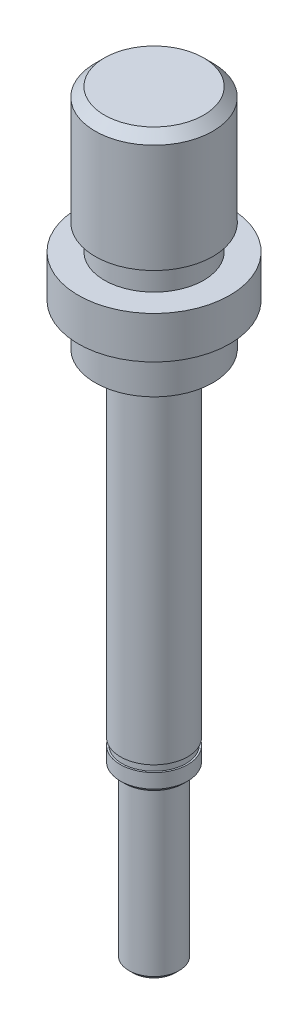
ISO-10303-21;
HEADER;
FILE_DESCRIPTION(('STEP AP214'),'2;1');
FILE_NAME('part.step','',(''),(''),'','','');
FILE_SCHEMA(('AUTOMOTIVE_DESIGN { 1 0 10303 214 1 1 1 1 }'));
ENDSEC;
DATA;
#1=APPLICATION_CONTEXT('core data for automotive mechanical design processes');
#2=APPLICATION_PROTOCOL_DEFINITION('international standard','automotive_design',2000,#1);
#3=PRODUCT_CONTEXT('',#1,'mechanical');
#4=PRODUCT('Part','Part','',(#3));
#5=PRODUCT_RELATED_PRODUCT_CATEGORY('part','',(#4));
#6=PRODUCT_DEFINITION_FORMATION('','',#4);
#7=PRODUCT_DEFINITION_CONTEXT('part definition',#1,'design');
#8=PRODUCT_DEFINITION('design','',#6,#7);
#9=PRODUCT_DEFINITION_SHAPE('','',#8);
#10=(LENGTH_UNIT() NAMED_UNIT(*) SI_UNIT(.MILLI.,.METRE.));
#11=(NAMED_UNIT(*) PLANE_ANGLE_UNIT() SI_UNIT($,.RADIAN.));
#12=(NAMED_UNIT(*) SI_UNIT($,.STERADIAN.) SOLID_ANGLE_UNIT());
#13=UNCERTAINTY_MEASURE_WITH_UNIT(LENGTH_MEASURE(1.E-05),#10,'distance_accuracy_value','');
#14=(GEOMETRIC_REPRESENTATION_CONTEXT(3) GLOBAL_UNCERTAINTY_ASSIGNED_CONTEXT((#13)) GLOBAL_UNIT_ASSIGNED_CONTEXT((#10,
#11,#12)) REPRESENTATION_CONTEXT('',''));
#15=CARTESIAN_POINT('',(0.,0.,0.));
#16=DIRECTION('',(0.,0.,1.));
#17=DIRECTION('',(1.,0.,0.));
#18=AXIS2_PLACEMENT_3D('',#15,#16,#17);
#19=CARTESIAN_POINT('',(-9.2098046360951E-13,73.,0.));
#20=DIRECTION('',(0.,1.,0.));
#21=DIRECTION('',(-1.,0.,0.));
#22=AXIS2_PLACEMENT_3D('',#19,#20,#21);
#23=PLANE('',#22);
#24=CARTESIAN_POINT('',(0.,73.,0.));
#25=DIRECTION('',(0.,-1.,0.));
#26=DIRECTION('',(1.,0.,0.));
#27=AXIS2_PLACEMENT_3D('',#24,#25,#26);
#28=CIRCLE('',#27,5.9);
#29=CARTESIAN_POINT('',(5.9,73.,0.));
#30=VERTEX_POINT('',#29);
#31=EDGE_CURVE('E78',#30,#30,#28,.T.);
#32=ORIENTED_EDGE('',*,*,#31,.T.);
#33=EDGE_LOOP('',(#32));
#34=FACE_BOUND('',#33,.T.);
#35=CARTESIAN_POINT('',(0.,73.,0.));
#36=DIRECTION('',(0.,-1.,0.));
#37=DIRECTION('',(1.,0.,0.));
#38=AXIS2_PLACEMENT_3D('',#35,#36,#37);
#39=CIRCLE('',#38,8.99999999999999);
#40=CARTESIAN_POINT('',(8.99999999999999,73.,0.));
#41=VERTEX_POINT('',#40);
#42=EDGE_CURVE('E126',#41,#41,#39,.T.);
#43=ORIENTED_EDGE('',*,*,#42,.F.);
#44=EDGE_LOOP('',(#43));
#45=FACE_BOUND('',#44,.T.);
#46=ADVANCED_FACE('F50',(#34,#45),#23,.T.);
#47=CARTESIAN_POINT('',(0.,0.,0.));
#48=DIRECTION('',(0.,-1.,0.));
#49=DIRECTION('',(1.,0.,0.));
#50=AXIS2_PLACEMENT_3D('',#47,#48,#49);
#51=CYLINDRICAL_SURFACE('',#50,5.9);
#52=CARTESIAN_POINT('',(0.,76.,0.));
#53=DIRECTION('',(0.,-1.,0.));
#54=DIRECTION('',(1.,0.,0.));
#55=AXIS2_PLACEMENT_3D('',#52,#53,#54);
#56=CIRCLE('',#55,5.9);
#57=CARTESIAN_POINT('',(5.9,76.,0.));
#58=VERTEX_POINT('',#57);
#59=EDGE_CURVE('E82',#58,#58,#56,.T.);
#60=ORIENTED_EDGE('',*,*,#59,.T.);
#61=EDGE_LOOP('',(#60));
#62=FACE_BOUND('',#61,.T.);
#63=ORIENTED_EDGE('',*,*,#31,.F.);
#64=EDGE_LOOP('',(#63));
#65=FACE_BOUND('',#64,.T.);
#66=ADVANCED_FACE('F158',(#62,#65),#51,.T.);
#67=CARTESIAN_POINT('',(-9.5882897581264E-13,76.,0.));
#68=DIRECTION('',(0.,1.,0.));
#69=DIRECTION('',(-1.,0.,0.));
#70=AXIS2_PLACEMENT_3D('',#67,#68,#69);
#71=PLANE('',#70);
#72=ORIENTED_EDGE('',*,*,#59,.F.);
#73=EDGE_LOOP('',(#72));
#74=FACE_BOUND('',#73,.T.);
#75=CARTESIAN_POINT('',(0.,76.,0.));
#76=DIRECTION('',(0.,-1.,0.));
#77=DIRECTION('',(1.,0.,0.));
#78=AXIS2_PLACEMENT_3D('',#75,#76,#77);
#79=CIRCLE('',#78,7.);
#80=CARTESIAN_POINT('',(7.,76.,0.));
#81=VERTEX_POINT('',#80);
#82=EDGE_CURVE('E86',#81,#81,#79,.T.);
#83=ORIENTED_EDGE('',*,*,#82,.T.);
#84=EDGE_LOOP('',(#83));
#85=FACE_BOUND('',#84,.T.);
#86=ADVANCED_FACE('F164',(#74,#85),#71,.F.);
#87=CARTESIAN_POINT('',(0.,0.,0.));
#88=DIRECTION('',(0.,-1.,0.));
#89=DIRECTION('',(1.,0.,0.));
#90=AXIS2_PLACEMENT_3D('',#87,#88,#89);
#91=CYLINDRICAL_SURFACE('',#90,7.);
#92=CARTESIAN_POINT('',(0.,88.8985,0.));
#93=DIRECTION('',(0.,-1.,0.));
#94=DIRECTION('',(0.,0.,-1.));
#95=AXIS2_PLACEMENT_3D('',#92,#93,#94);
#96=CIRCLE('',#95,7.);
#97=CARTESIAN_POINT('',(0.,88.8985,-7.));
#98=VERTEX_POINT('',#97);
#99=EDGE_CURVE('E129',#98,#98,#96,.T.);
#100=ORIENTED_EDGE('',*,*,#99,.T.);
#101=EDGE_LOOP('',(#100));
#102=FACE_BOUND('',#101,.T.);
#103=ORIENTED_EDGE('',*,*,#82,.F.);
#104=EDGE_LOOP('',(#103));
#105=FACE_BOUND('',#104,.T.);
#106=ADVANCED_FACE('F174',(#102,#105),#91,.T.);
#107=CARTESIAN_POINT('',(0.,0.,0.));
#108=DIRECTION('',(0.,1.,0.));
#109=DIRECTION('',(-1.,0.,0.));
#110=AXIS2_PLACEMENT_3D('',#107,#108,#109);
#111=PLANE('',#110);
#112=CARTESIAN_POINT('',(0.,0.,0.));
#113=DIRECTION('',(0.,1.,0.));
#114=DIRECTION('',(-1.,0.,0.));
#115=AXIS2_PLACEMENT_3D('',#112,#113,#114);
#116=CIRCLE('',#115,2.498);
#117=CARTESIAN_POINT('',(-2.498,0.,0.));
#118=VERTEX_POINT('',#117);
#119=EDGE_CURVE('E59',#118,#118,#116,.F.);
#120=ORIENTED_EDGE('',*,*,#119,.T.);
#121=EDGE_LOOP('',(#120));
#122=FACE_BOUND('',#121,.T.);
#123=ADVANCED_FACE('F180',(#122),#111,.F.);
#124=CARTESIAN_POINT('',(0.,0.,0.));
#125=DIRECTION('',(0.,-1.,0.));
#126=DIRECTION('',(1.,0.,0.));
#127=AXIS2_PLACEMENT_3D('',#124,#125,#126);
#128=CYLINDRICAL_SURFACE('',#127,2.998);
#129=CARTESIAN_POINT('',(0.,0.499999999999996,0.));
#130=DIRECTION('',(0.,1.,0.));
#131=DIRECTION('',(-1.,0.,0.));
#132=AXIS2_PLACEMENT_3D('',#129,#130,#131);
#133=CIRCLE('',#132,2.998);
#134=CARTESIAN_POINT('',(-2.998,0.499999999999996,0.));
#135=VERTEX_POINT('',#134);
#136=EDGE_CURVE('E10',#135,#135,#133,.T.);
#137=ORIENTED_EDGE('',*,*,#136,.T.);
#138=EDGE_LOOP('',(#137));
#139=FACE_BOUND('',#138,.T.);
#140=CARTESIAN_POINT('',(0.,20.,0.));
#141=DIRECTION('',(0.,-1.,0.));
#142=DIRECTION('',(1.,0.,0.));
#143=AXIS2_PLACEMENT_3D('',#140,#141,#142);
#144=CIRCLE('',#143,2.998);
#145=CARTESIAN_POINT('',(2.998,20.,0.));
#146=VERTEX_POINT('',#145);
#147=EDGE_CURVE('E90',#146,#146,#144,.T.);
#148=ORIENTED_EDGE('',*,*,#147,.T.);
#149=EDGE_LOOP('',(#148));
#150=FACE_BOUND('',#149,.T.);
#151=ADVANCED_FACE('F192',(#139,#150),#128,.T.);
#152=CARTESIAN_POINT('',(0.,20.,0.));
#153=DIRECTION('',(0.,1.,0.));
#154=DIRECTION('',(-1.,0.,0.));
#155=AXIS2_PLACEMENT_3D('',#152,#153,#154);
#156=PLANE('',#155);
#157=CARTESIAN_POINT('',(0.,20.,0.));
#158=DIRECTION('',(0.,1.,0.));
#159=DIRECTION('',(-1.,0.,0.));
#160=AXIS2_PLACEMENT_3D('',#157,#158,#159);
#161=CIRCLE('',#160,3.498);
#162=CARTESIAN_POINT('',(-3.498,20.,0.));
#163=VERTEX_POINT('',#162);
#164=EDGE_CURVE('E72',#163,#163,#161,.F.);
#165=ORIENTED_EDGE('',*,*,#164,.T.);
#166=EDGE_LOOP('',(#165));
#167=FACE_BOUND('',#166,.T.);
#168=ORIENTED_EDGE('',*,*,#147,.F.);
#169=EDGE_LOOP('',(#168));
#170=FACE_BOUND('',#169,.T.);
#171=ADVANCED_FACE('F231',(#167,#170),#156,.F.);
#172=CARTESIAN_POINT('',(0.,0.,0.));
#173=DIRECTION('',(0.,-1.,0.));
#174=DIRECTION('',(1.,0.,0.));
#175=AXIS2_PLACEMENT_3D('',#172,#173,#174);
#176=CYLINDRICAL_SURFACE('',#175,3.998);
#177=CARTESIAN_POINT('',(0.,20.5,0.));
#178=DIRECTION('',(0.,1.,0.));
#179=DIRECTION('',(-1.,0.,0.));
#180=AXIS2_PLACEMENT_3D('',#177,#178,#179);
#181=CIRCLE('',#180,3.998);
#182=CARTESIAN_POINT('',(-3.998,20.5,0.));
#183=VERTEX_POINT('',#182);
#184=EDGE_CURVE('E66',#183,#183,#181,.T.);
#185=ORIENTED_EDGE('',*,*,#184,.T.);
#186=EDGE_LOOP('',(#185));
#187=FACE_BOUND('',#186,.T.);
#188=CARTESIAN_POINT('',(0.,22.2,0.));
#189=DIRECTION('',(0.,-1.,0.));
#190=DIRECTION('',(1.,0.,0.));
#191=AXIS2_PLACEMENT_3D('',#188,#189,#190);
#192=CIRCLE('',#191,3.998);
#193=CARTESIAN_POINT('',(3.998,22.2,0.));
#194=VERTEX_POINT('',#193);
#195=EDGE_CURVE('E94',#194,#194,#192,.T.);
#196=ORIENTED_EDGE('',*,*,#195,.T.);
#197=EDGE_LOOP('',(#196));
#198=FACE_BOUND('',#197,.T.);
#199=ADVANCED_FACE('F218',(#187,#198),#176,.T.);
#200=CARTESIAN_POINT('',(0.,22.2,0.));
#201=DIRECTION('',(0.,1.,0.));
#202=DIRECTION('',(-1.,0.,0.));
#203=AXIS2_PLACEMENT_3D('',#200,#201,#202);
#204=PLANE('',#203);
#205=CARTESIAN_POINT('',(0.,22.2,0.));
#206=DIRECTION('',(0.,-1.,0.));
#207=DIRECTION('',(1.,0.,0.));
#208=AXIS2_PLACEMENT_3D('',#205,#206,#207);
#209=CIRCLE('',#208,3.8);
#210=CARTESIAN_POINT('',(3.8,22.2,0.));
#211=VERTEX_POINT('',#210);
#212=EDGE_CURVE('E98',#211,#211,#209,.T.);
#213=ORIENTED_EDGE('',*,*,#212,.T.);
#214=EDGE_LOOP('',(#213));
#215=FACE_BOUND('',#214,.T.);
#216=ORIENTED_EDGE('',*,*,#195,.F.);
#217=EDGE_LOOP('',(#216));
#218=FACE_BOUND('',#217,.T.);
#219=ADVANCED_FACE('F227',(#215,#218),#204,.T.);
#220=CARTESIAN_POINT('',(0.,0.,0.));
#221=DIRECTION('',(0.,-1.,0.));
#222=DIRECTION('',(1.,0.,0.));
#223=AXIS2_PLACEMENT_3D('',#220,#221,#222);
#224=CYLINDRICAL_SURFACE('',#223,3.8);
#225=ORIENTED_EDGE('',*,*,#212,.F.);
#226=EDGE_LOOP('',(#225));
#227=FACE_BOUND('',#226,.T.);
#228=CARTESIAN_POINT('',(0.,23.,0.));
#229=DIRECTION('',(0.,-1.,0.));
#230=DIRECTION('',(1.,0.,0.));
#231=AXIS2_PLACEMENT_3D('',#228,#229,#230);
#232=CIRCLE('',#231,3.8);
#233=CARTESIAN_POINT('',(3.8,23.,0.));
#234=VERTEX_POINT('',#233);
#235=EDGE_CURVE('E102',#234,#234,#232,.T.);
#236=ORIENTED_EDGE('',*,*,#235,.T.);
#237=EDGE_LOOP('',(#236));
#238=FACE_BOUND('',#237,.T.);
#239=ADVANCED_FACE('F223',(#227,#238),#224,.T.);
#240=CARTESIAN_POINT('',(4.03016565125915E-13,23.,0.));
#241=DIRECTION('',(0.,1.,0.));
#242=DIRECTION('',(-1.,0.,0.));
#243=AXIS2_PLACEMENT_3D('',#240,#241,#242);
#244=PLANE('',#243);
#245=ORIENTED_EDGE('',*,*,#235,.F.);
#246=EDGE_LOOP('',(#245));
#247=FACE_BOUND('',#246,.T.);
#248=CARTESIAN_POINT('',(0.,23.,0.));
#249=DIRECTION('',(0.,-1.,0.));
#250=DIRECTION('',(1.,0.,0.));
#251=AXIS2_PLACEMENT_3D('',#248,#249,#250);
#252=CIRCLE('',#251,3.998);
#253=CARTESIAN_POINT('',(3.998,23.,0.));
#254=VERTEX_POINT('',#253);
#255=EDGE_CURVE('E106',#254,#254,#252,.T.);
#256=ORIENTED_EDGE('',*,*,#255,.T.);
#257=EDGE_LOOP('',(#256));
#258=FACE_BOUND('',#257,.T.);
#259=ADVANCED_FACE('F215',(#247,#258),#244,.F.);
#260=ORIENTED_EDGE('',*,*,#255,.F.);
#261=EDGE_LOOP('',(#260));
#262=FACE_BOUND('',#261,.T.);
#263=CARTESIAN_POINT('',(0.,63.,0.));
#264=DIRECTION('',(0.,-1.,0.));
#265=DIRECTION('',(1.,0.,0.));
#266=AXIS2_PLACEMENT_3D('',#263,#264,#265);
#267=CIRCLE('',#266,3.998);
#268=CARTESIAN_POINT('',(3.998,63.,0.));
#269=VERTEX_POINT('',#268);
#270=EDGE_CURVE('E110',#269,#269,#267,.T.);
#271=ORIENTED_EDGE('',*,*,#270,.T.);
#272=EDGE_LOOP('',(#271));
#273=FACE_BOUND('',#272,.T.);
#274=ADVANCED_FACE('F205',(#262,#273),#176,.T.);
#275=CARTESIAN_POINT('',(0.,63.,0.));
#276=DIRECTION('',(0.,1.,0.));
#277=DIRECTION('',(-1.,0.,0.));
#278=AXIS2_PLACEMENT_3D('',#275,#276,#277);
#279=PLANE('',#278);
#280=ORIENTED_EDGE('',*,*,#270,.F.);
#281=EDGE_LOOP('',(#280));
#282=FACE_BOUND('',#281,.T.);
#283=CARTESIAN_POINT('',(0.,63.,0.));
#284=DIRECTION('',(0.,-1.,0.));
#285=DIRECTION('',(1.,0.,0.));
#286=AXIS2_PLACEMENT_3D('',#283,#284,#285);
#287=CIRCLE('',#286,7.);
#288=CARTESIAN_POINT('',(7.,63.,0.));
#289=VERTEX_POINT('',#288);
#290=EDGE_CURVE('E114',#289,#289,#287,.T.);
#291=ORIENTED_EDGE('',*,*,#290,.T.);
#292=EDGE_LOOP('',(#291));
#293=FACE_BOUND('',#292,.T.);
#294=ADVANCED_FACE('F197',(#282,#293),#279,.F.);
#295=ORIENTED_EDGE('',*,*,#290,.F.);
#296=EDGE_LOOP('',(#295));
#297=FACE_BOUND('',#296,.T.);
#298=CARTESIAN_POINT('',(0.,68.,0.));
#299=DIRECTION('',(0.,-1.,0.));
#300=DIRECTION('',(1.,0.,0.));
#301=AXIS2_PLACEMENT_3D('',#298,#299,#300);
#302=CIRCLE('',#301,7.);
#303=CARTESIAN_POINT('',(7.,68.,0.));
#304=VERTEX_POINT('',#303);
#305=EDGE_CURVE('E118',#304,#304,#302,.T.);
#306=ORIENTED_EDGE('',*,*,#305,.T.);
#307=EDGE_LOOP('',(#306));
#308=FACE_BOUND('',#307,.T.);
#309=ADVANCED_FACE('F183',(#297,#308),#91,.T.);
#310=CARTESIAN_POINT('',(0.,68.,0.));
#311=DIRECTION('',(0.,-1.,0.));
#312=DIRECTION('',(1.,0.,0.));
#313=AXIS2_PLACEMENT_3D('',#310,#311,#312);
#314=PLANE('',#313);
#315=CARTESIAN_POINT('',(0.,68.,0.));
#316=DIRECTION('',(0.,-1.,0.));
#317=DIRECTION('',(1.,0.,0.));
#318=AXIS2_PLACEMENT_3D('',#315,#316,#317);
#319=CIRCLE('',#318,8.99999999999999);
#320=CARTESIAN_POINT('',(8.99999999999999,68.,0.));
#321=VERTEX_POINT('',#320);
#322=EDGE_CURVE('E122',#321,#321,#319,.T.);
#323=ORIENTED_EDGE('',*,*,#322,.T.);
#324=EDGE_LOOP('',(#323));
#325=FACE_BOUND('',#324,.T.);
#326=ORIENTED_EDGE('',*,*,#305,.F.);
#327=EDGE_LOOP('',(#326));
#328=FACE_BOUND('',#327,.T.);
#329=ADVANCED_FACE('F196',(#325,#328),#314,.T.);
#330=CARTESIAN_POINT('',(0.,0.,0.));
#331=DIRECTION('',(0.,-1.,0.));
#332=DIRECTION('',(1.,0.,0.));
#333=AXIS2_PLACEMENT_3D('',#330,#331,#332);
#334=CYLINDRICAL_SURFACE('',#333,8.99999999999999);
#335=ORIENTED_EDGE('',*,*,#322,.F.);
#336=EDGE_LOOP('',(#335));
#337=FACE_BOUND('',#336,.T.);
#338=ORIENTED_EDGE('',*,*,#42,.T.);
#339=EDGE_LOOP('',(#338));
#340=FACE_BOUND('',#339,.T.);
#341=ADVANCED_FACE('F152',(#337,#340),#334,.T.);
#342=CARTESIAN_POINT('',(0.,90.,0.));
#343=DIRECTION('',(0.,-1.,0.));
#344=DIRECTION('',(0.,0.,-1.));
#345=AXIS2_PLACEMENT_3D('',#342,#343,#344);
#346=CONICAL_SURFACE('',#345,5.8985,0.785398163397458);
#347=ORIENTED_EDGE('',*,*,#99,.F.);
#348=EDGE_LOOP('',(#347));
#349=FACE_BOUND('',#348,.T.);
#350=CARTESIAN_POINT('',(0.,90.,0.));
#351=DIRECTION('',(0.,-1.,0.));
#352=DIRECTION('',(0.,0.,-1.));
#353=AXIS2_PLACEMENT_3D('',#350,#351,#352);
#354=CIRCLE('',#353,5.8985);
#355=CARTESIAN_POINT('',(0.,90.,-5.8985));
#356=VERTEX_POINT('',#355);
#357=EDGE_CURVE('E133',#356,#356,#354,.T.);
#358=ORIENTED_EDGE('',*,*,#357,.T.);
#359=EDGE_LOOP('',(#358));
#360=FACE_BOUND('',#359,.T.);
#361=ADVANCED_FACE('F139',(#349,#360),#346,.T.);
#362=CARTESIAN_POINT('',(0.,90.,0.));
#363=DIRECTION('',(0.,-1.,0.));
#364=DIRECTION('',(1.,0.,0.));
#365=AXIS2_PLACEMENT_3D('',#362,#363,#364);
#366=PLANE('',#365);
#367=ORIENTED_EDGE('',*,*,#357,.F.);
#368=EDGE_LOOP('',(#367));
#369=FACE_BOUND('',#368,.T.);
#370=ADVANCED_FACE('F141',(#369),#366,.F.);
#371=CARTESIAN_POINT('',(0.,20.,0.));
#372=DIRECTION('',(0.,1.,0.));
#373=DIRECTION('',(-1.,0.,0.));
#374=AXIS2_PLACEMENT_3D('',#371,#372,#373);
#375=CONICAL_SURFACE('',#374,3.498,0.785398163397447);
#376=ORIENTED_EDGE('',*,*,#184,.F.);
#377=EDGE_LOOP('',(#376));
#378=FACE_BOUND('',#377,.T.);
#379=ORIENTED_EDGE('',*,*,#164,.F.);
#380=EDGE_LOOP('',(#379));
#381=FACE_BOUND('',#380,.T.);
#382=ADVANCED_FACE('F143',(#378,#381),#375,.T.);
#383=CARTESIAN_POINT('',(0.,0.,0.));
#384=DIRECTION('',(0.,1.,0.));
#385=DIRECTION('',(-1.,0.,0.));
#386=AXIS2_PLACEMENT_3D('',#383,#384,#385);
#387=CONICAL_SURFACE('',#386,2.498,0.785398163397452);
#388=ORIENTED_EDGE('',*,*,#136,.F.);
#389=EDGE_LOOP('',(#388));
#390=FACE_BOUND('',#389,.T.);
#391=ORIENTED_EDGE('',*,*,#119,.F.);
#392=EDGE_LOOP('',(#391));
#393=FACE_BOUND('',#392,.T.);
#394=ADVANCED_FACE('F53',(#390,#393),#387,.T.);
#395=CLOSED_SHELL('',(#46,#66,#86,#106,#123,#151,#171,#199,#219,#239,#259,#274,#294,#309,#329,
#341,#361,#370,#382,#394));
#396=MANIFOLD_SOLID_BREP('B2',#395);
#397=ADVANCED_BREP_SHAPE_REPRESENTATION('',(#18,#396),#14);
#398=SHAPE_DEFINITION_REPRESENTATION(#9,#397);
ENDSEC;
END-ISO-10303-21;
